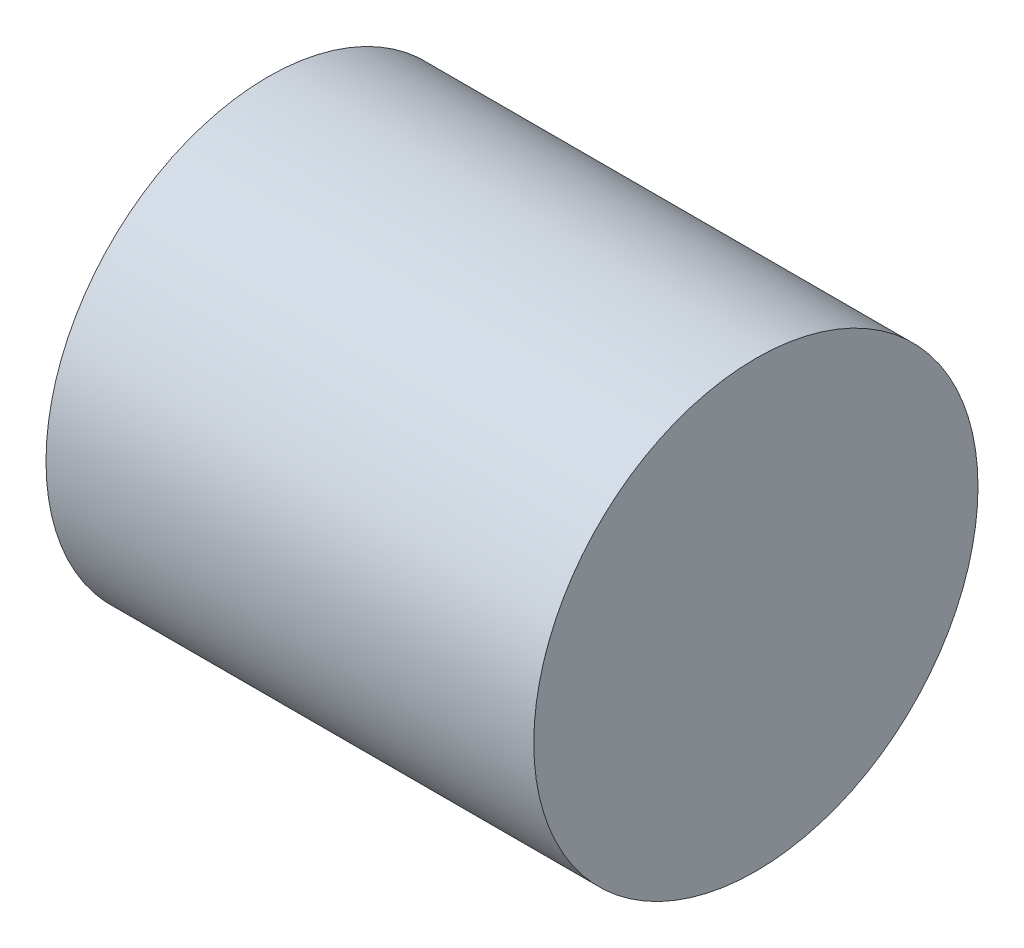
ISO-10303-21;
HEADER;
FILE_DESCRIPTION(('STEP AP214'),'2;1');
FILE_NAME('part.step','',(''),(''),'','','');
FILE_SCHEMA(('AUTOMOTIVE_DESIGN { 1 0 10303 214 1 1 1 1 }'));
ENDSEC;
DATA;
#1=APPLICATION_CONTEXT('core data for automotive mechanical design processes');
#2=APPLICATION_PROTOCOL_DEFINITION('international standard','automotive_design',2000,#1);
#3=PRODUCT_CONTEXT('',#1,'mechanical');
#4=PRODUCT('Part','Part','',(#3));
#5=PRODUCT_RELATED_PRODUCT_CATEGORY('part','',(#4));
#6=PRODUCT_DEFINITION_FORMATION('','',#4);
#7=PRODUCT_DEFINITION_CONTEXT('part definition',#1,'design');
#8=PRODUCT_DEFINITION('design','',#6,#7);
#9=PRODUCT_DEFINITION_SHAPE('','',#8);
#10=(LENGTH_UNIT() NAMED_UNIT(*) SI_UNIT(.MILLI.,.METRE.));
#11=(NAMED_UNIT(*) PLANE_ANGLE_UNIT() SI_UNIT($,.RADIAN.));
#12=(NAMED_UNIT(*) SI_UNIT($,.STERADIAN.) SOLID_ANGLE_UNIT());
#13=UNCERTAINTY_MEASURE_WITH_UNIT(LENGTH_MEASURE(1.E-05),#10,'distance_accuracy_value','');
#14=(GEOMETRIC_REPRESENTATION_CONTEXT(3) GLOBAL_UNCERTAINTY_ASSIGNED_CONTEXT((#13)) GLOBAL_UNIT_ASSIGNED_CONTEXT((#10,
#11,#12)) REPRESENTATION_CONTEXT('',''));
#15=CARTESIAN_POINT('',(0.,0.,0.));
#16=DIRECTION('',(0.,0.,1.));
#17=DIRECTION('',(1.,0.,0.));
#18=AXIS2_PLACEMENT_3D('',#15,#16,#17);
#19=CARTESIAN_POINT('',(56.96458,438.166256,-86.798404));
#20=DIRECTION('',(-1.,0.,0.));
#21=DIRECTION('',(0.,0.,1.));
#22=AXIS2_PLACEMENT_3D('',#19,#20,#21);
#23=CYLINDRICAL_SURFACE('',#22,25.9391100128346);
#24=CARTESIAN_POINT('',(56.96458,438.166256,-86.798404));
#25=DIRECTION('',(1.,0.,0.));
#26=DIRECTION('',(0.,0.,-1.));
#27=AXIS2_PLACEMENT_3D('',#24,#25,#26);
#28=CIRCLE('',#27,25.9391100128346);
#29=CARTESIAN_POINT('',(56.96458,438.166256,-112.737514012835));
#30=VERTEX_POINT('',#29);
#31=EDGE_CURVE('E10',#30,#30,#28,.T.);
#32=ORIENTED_EDGE('',*,*,#31,.F.);
#33=EDGE_LOOP('',(#32));
#34=FACE_BOUND('',#33,.T.);
#35=CARTESIAN_POINT('',(0.,438.166256,-86.798404));
#36=DIRECTION('',(1.,0.,0.));
#37=DIRECTION('',(0.,0.,-1.));
#38=AXIS2_PLACEMENT_3D('',#35,#36,#37);
#39=CIRCLE('',#38,25.9391100128346);
#40=CARTESIAN_POINT('',(0.,438.166256,-112.737514012835));
#41=VERTEX_POINT('',#40);
#42=EDGE_CURVE('E34',#41,#41,#39,.T.);
#43=ORIENTED_EDGE('',*,*,#42,.T.);
#44=EDGE_LOOP('',(#43));
#45=FACE_BOUND('',#44,.T.);
#46=ADVANCED_FACE('F31',(#34,#45),#23,.T.);
#47=CARTESIAN_POINT('',(56.96458,438.166256,-86.798404));
#48=DIRECTION('',(1.,0.,0.));
#49=DIRECTION('',(0.,0.,-1.));
#50=AXIS2_PLACEMENT_3D('',#47,#48,#49);
#51=PLANE('',#50);
#52=ORIENTED_EDGE('',*,*,#31,.T.);
#53=EDGE_LOOP('',(#52));
#54=FACE_BOUND('',#53,.T.);
#55=ADVANCED_FACE('F46',(#54),#51,.T.);
#56=CARTESIAN_POINT('',(0.,438.166256,-86.798404));
#57=DIRECTION('',(1.,0.,0.));
#58=DIRECTION('',(0.,0.,-1.));
#59=AXIS2_PLACEMENT_3D('',#56,#57,#58);
#60=PLANE('',#59);
#61=ORIENTED_EDGE('',*,*,#42,.F.);
#62=EDGE_LOOP('',(#61));
#63=FACE_BOUND('',#62,.T.);
#64=ADVANCED_FACE('F44',(#63),#60,.F.);
#65=CLOSED_SHELL('',(#46,#55,#64));
#66=MANIFOLD_SOLID_BREP('B2',#65);
#67=ADVANCED_BREP_SHAPE_REPRESENTATION('',(#18,#66),#14);
#68=SHAPE_DEFINITION_REPRESENTATION(#9,#67);
ENDSEC;
END-ISO-10303-21;
